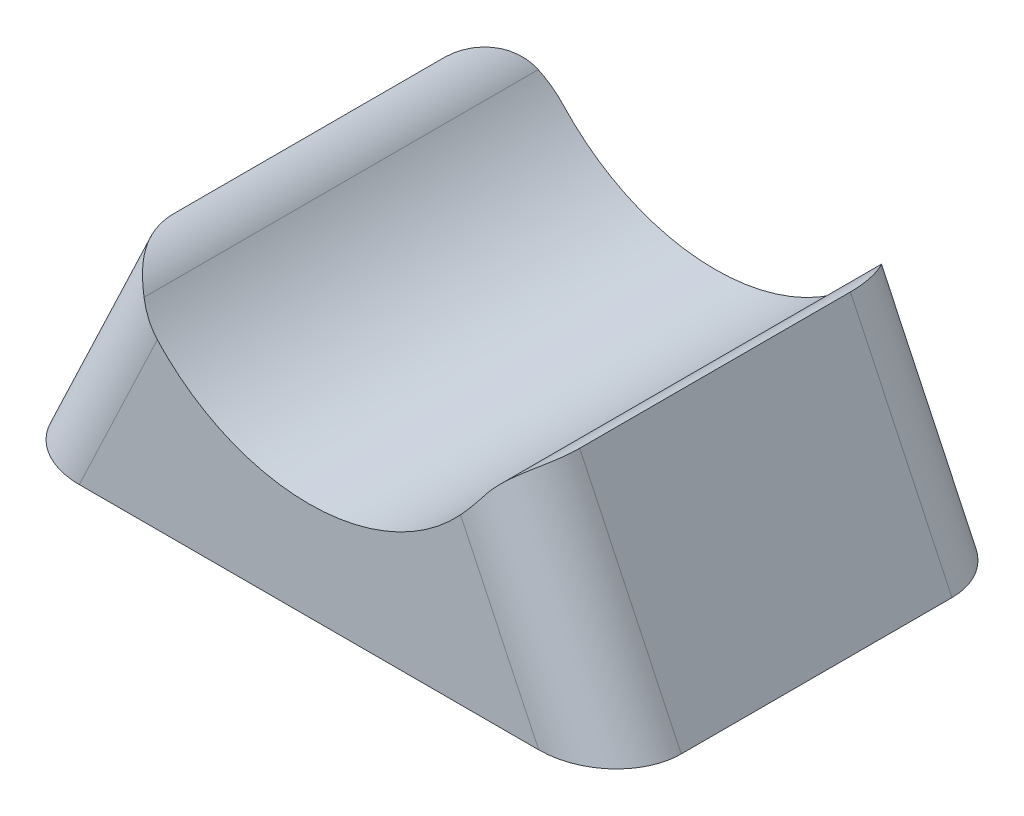
ISO-10303-21;
HEADER;
FILE_DESCRIPTION(('STEP AP214'),'2;1');
FILE_NAME('part.step','',(''),(''),'','','');
FILE_SCHEMA(('AUTOMOTIVE_DESIGN { 1 0 10303 214 1 1 1 1 }'));
ENDSEC;
DATA;
#1=APPLICATION_CONTEXT('core data for automotive mechanical design processes');
#2=APPLICATION_PROTOCOL_DEFINITION('international standard','automotive_design',2000,#1);
#3=PRODUCT_CONTEXT('',#1,'mechanical');
#4=PRODUCT('Part','Part','',(#3));
#5=PRODUCT_RELATED_PRODUCT_CATEGORY('part','',(#4));
#6=PRODUCT_DEFINITION_FORMATION('','',#4);
#7=PRODUCT_DEFINITION_CONTEXT('part definition',#1,'design');
#8=PRODUCT_DEFINITION('design','',#6,#7);
#9=PRODUCT_DEFINITION_SHAPE('','',#8);
#10=(LENGTH_UNIT() NAMED_UNIT(*) SI_UNIT(.MILLI.,.METRE.));
#11=(NAMED_UNIT(*) PLANE_ANGLE_UNIT() SI_UNIT($,.RADIAN.));
#12=(NAMED_UNIT(*) SI_UNIT($,.STERADIAN.) SOLID_ANGLE_UNIT());
#13=UNCERTAINTY_MEASURE_WITH_UNIT(LENGTH_MEASURE(1.E-05),#10,'distance_accuracy_value','');
#14=(GEOMETRIC_REPRESENTATION_CONTEXT(3) GLOBAL_UNCERTAINTY_ASSIGNED_CONTEXT((#13)) GLOBAL_UNIT_ASSIGNED_CONTEXT((#10,
#11,#12)) REPRESENTATION_CONTEXT('',''));
#15=CARTESIAN_POINT('',(0.,0.,0.));
#16=DIRECTION('',(0.,0.,1.));
#17=DIRECTION('',(1.,0.,0.));
#18=AXIS2_PLACEMENT_3D('',#15,#16,#17);
#19=CARTESIAN_POINT('',(9.00000000000001,0.,-6.));
#20=DIRECTION('',(0.903507902905251,0.428571428571429,0.));
#21=DIRECTION('',(-0.428571428571429,0.903507902905251,0.));
#22=AXIS2_PLACEMENT_3D('',#19,#20,#21);
#23=PLANE('',#22);
#24=DIRECTION('',(0.,0.,1.));
#25=VECTOR('',#24,1.);
#26=CARTESIAN_POINT('',(9.00000000000001,0.,-6.));
#27=LINE('',#26,#25);
#28=CARTESIAN_POINT('',(9.00000000000001,0.,-4.));
#29=VERTEX_POINT('',#28);
#30=CARTESIAN_POINT('',(9.00000000000001,0.,4.));
#31=VERTEX_POINT('',#30);
#32=EDGE_CURVE('E142',#29,#31,#27,.T.);
#33=ORIENTED_EDGE('',*,*,#32,.F.);
#34=DIRECTION('',(-0.428571428571429,0.903507902905251,0.));
#35=VECTOR('',#34,1.);
#36=CARTESIAN_POINT('',(6.,6.32455532033676,-4.));
#37=LINE('',#36,#35);
#38=CARTESIAN_POINT('',(6.,6.32455532033676,-4.));
#39=VERTEX_POINT('',#38);
#40=EDGE_CURVE('E168',#29,#39,#37,.T.);
#41=ORIENTED_EDGE('',*,*,#40,.T.);
#42=DIRECTION('',(0.,0.,1.));
#43=VECTOR('',#42,1.);
#44=CARTESIAN_POINT('',(6.,6.32455532033676,-6.));
#45=LINE('',#44,#43);
#46=CARTESIAN_POINT('',(6.,6.32455532033676,4.));
#47=VERTEX_POINT('',#46);
#48=EDGE_CURVE('E254',#39,#47,#45,.T.);
#49=ORIENTED_EDGE('',*,*,#48,.T.);
#50=DIRECTION('',(-0.428571428571429,0.903507902905251,0.));
#51=VECTOR('',#50,1.);
#52=CARTESIAN_POINT('',(9.00000000000001,0.,4.));
#53=LINE('',#52,#51);
#54=EDGE_CURVE('E148',#47,#31,#53,.F.);
#55=ORIENTED_EDGE('',*,*,#54,.T.);
#56=EDGE_LOOP('',(#33,#41,#49,#55));
#57=FACE_BOUND('',#56,.T.);
#58=ADVANCED_FACE('F38',(#57),#23,.T.);
#59=CARTESIAN_POINT('',(0.,0.,0.));
#60=DIRECTION('',(0.,1.,0.));
#61=DIRECTION('',(0.,0.,1.));
#62=AXIS2_PLACEMENT_3D('',#59,#60,#61);
#63=PLANE('',#62);
#64=DIRECTION('',(0.,0.,1.));
#65=VECTOR('',#64,1.);
#66=CARTESIAN_POINT('',(-9.,0.,-6.));
#67=LINE('',#66,#65);
#68=CARTESIAN_POINT('',(-9.,0.,-4.));
#69=VERTEX_POINT('',#68);
#70=CARTESIAN_POINT('',(-9.,0.,4.));
#71=VERTEX_POINT('',#70);
#72=EDGE_CURVE('E261',#69,#71,#67,.T.);
#73=ORIENTED_EDGE('',*,*,#72,.F.);
#74=CARTESIAN_POINT('',(-6.78640563788213,0.,-4.));
#75=DIRECTION('',(0.,1.,0.));
#76=DIRECTION('',(1.,0.,0.));
#77=AXIS2_PLACEMENT_3D('',#74,#75,#76);
#78=ELLIPSE('',#77,2.21359436211787,2.);
#79=CARTESIAN_POINT('',(-6.78640563788213,0.,-6.));
#80=VERTEX_POINT('',#79);
#81=EDGE_CURVE('E277',#69,#80,#78,.F.);
#82=ORIENTED_EDGE('',*,*,#81,.T.);
#83=DIRECTION('',(-1.,0.,0.));
#84=VECTOR('',#83,1.);
#85=CARTESIAN_POINT('',(-6.,0.,-6.));
#86=LINE('',#85,#84);
#87=CARTESIAN_POINT('',(6.78640563788214,0.,-6.));
#88=VERTEX_POINT('',#87);
#89=EDGE_CURVE('E135',#88,#80,#86,.T.);
#90=ORIENTED_EDGE('',*,*,#89,.F.);
#91=CARTESIAN_POINT('',(6.78640563788214,0.,-4.));
#92=DIRECTION('',(0.,1.,0.));
#93=DIRECTION('',(1.,0.,0.));
#94=AXIS2_PLACEMENT_3D('',#91,#92,#93);
#95=ELLIPSE('',#94,2.21359436211787,2.);
#96=EDGE_CURVE('E200',#88,#29,#95,.F.);
#97=ORIENTED_EDGE('',*,*,#96,.T.);
#98=ORIENTED_EDGE('',*,*,#32,.T.);
#99=CARTESIAN_POINT('',(6.78640563788214,0.,4.));
#100=DIRECTION('',(0.,1.,0.));
#101=DIRECTION('',(1.,0.,0.));
#102=AXIS2_PLACEMENT_3D('',#99,#100,#101);
#103=ELLIPSE('',#102,2.21359436211787,2.);
#104=CARTESIAN_POINT('',(6.78640563788214,0.,6.));
#105=VERTEX_POINT('',#104);
#106=EDGE_CURVE('E138',#31,#105,#103,.F.);
#107=ORIENTED_EDGE('',*,*,#106,.T.);
#108=DIRECTION('',(1.,0.,0.));
#109=VECTOR('',#108,1.);
#110=CARTESIAN_POINT('',(-6.,0.,6.));
#111=LINE('',#110,#109);
#112=CARTESIAN_POINT('',(-6.78640563788213,0.,6.));
#113=VERTEX_POINT('',#112);
#114=EDGE_CURVE('E123',#113,#105,#111,.T.);
#115=ORIENTED_EDGE('',*,*,#114,.F.);
#116=CARTESIAN_POINT('',(-6.78640563788213,0.,4.));
#117=DIRECTION('',(0.,1.,0.));
#118=DIRECTION('',(1.,0.,0.));
#119=AXIS2_PLACEMENT_3D('',#116,#117,#118);
#120=ELLIPSE('',#119,2.21359436211787,2.);
#121=EDGE_CURVE('E285',#113,#71,#120,.F.);
#122=ORIENTED_EDGE('',*,*,#121,.T.);
#123=EDGE_LOOP('',(#73,#82,#90,#97,#98,#107,#115,#122));
#124=FACE_BOUND('',#123,.T.);
#125=ADVANCED_FACE('F140',(#124),#63,.F.);
#126=CARTESIAN_POINT('',(-9.,0.,-6.));
#127=DIRECTION('',(-0.903507902905251,0.428571428571429,0.));
#128=DIRECTION('',(-0.428571428571429,-0.903507902905251,0.));
#129=AXIS2_PLACEMENT_3D('',#126,#127,#128);
#130=PLANE('',#129);
#131=DIRECTION('',(0.,0.,1.));
#132=VECTOR('',#131,1.);
#133=CARTESIAN_POINT('',(-6.,6.32455532033676,-6.));
#134=LINE('',#133,#132);
#135=CARTESIAN_POINT('',(-6.,6.32455532033676,-4.));
#136=VERTEX_POINT('',#135);
#137=CARTESIAN_POINT('',(-6.,6.32455532033676,4.));
#138=VERTEX_POINT('',#137);
#139=EDGE_CURVE('E257',#136,#138,#134,.T.);
#140=ORIENTED_EDGE('',*,*,#139,.F.);
#141=DIRECTION('',(-0.428571428571429,-0.903507902905251,0.));
#142=VECTOR('',#141,1.);
#143=CARTESIAN_POINT('',(-9.,0.,-4.));
#144=LINE('',#143,#142);
#145=EDGE_CURVE('E297',#136,#69,#144,.T.);
#146=ORIENTED_EDGE('',*,*,#145,.T.);
#147=ORIENTED_EDGE('',*,*,#72,.T.);
#148=DIRECTION('',(-0.428571428571429,-0.903507902905251,0.));
#149=VECTOR('',#148,1.);
#150=CARTESIAN_POINT('',(-6.,6.32455532033676,4.));
#151=LINE('',#150,#149);
#152=EDGE_CURVE('E67',#71,#138,#151,.F.);
#153=ORIENTED_EDGE('',*,*,#152,.T.);
#154=EDGE_LOOP('',(#140,#146,#147,#153));
#155=FACE_BOUND('',#154,.T.);
#156=ADVANCED_FACE('F307',(#155),#130,.T.);
#157=CARTESIAN_POINT('',(-6.,17.,6.));
#158=DIRECTION('',(0.,0.,-1.));
#159=DIRECTION('',(-1.,0.,0.));
#160=AXIS2_PLACEMENT_3D('',#157,#158,#159);
#161=PLANE('',#160);
#162=CARTESIAN_POINT('',(0.,9.,6.));
#163=DIRECTION('',(0.,0.,-1.));
#164=DIRECTION('',(-1.,0.,0.));
#165=AXIS2_PLACEMENT_3D('',#162,#163,#164);
#166=CIRCLE('',#165,6.1);
#167=CARTESIAN_POINT('',(4.48073029755396,4.86079041354729,6.));
#168=VERTEX_POINT('',#167);
#169=CARTESIAN_POINT('',(-4.48073029755395,4.86079041354729,6.));
#170=VERTEX_POINT('',#169);
#171=EDGE_CURVE('E134',#168,#170,#166,.T.);
#172=ORIENTED_EDGE('',*,*,#171,.T.);
#173=DIRECTION('',(-0.428571428571429,-0.903507902905251,0.));
#174=VECTOR('',#173,1.);
#175=CARTESIAN_POINT('',(-7.1929841941895,-0.857142857142862,6.));
#176=LINE('',#175,#174);
#177=EDGE_CURVE('E131',#170,#113,#176,.T.);
#178=ORIENTED_EDGE('',*,*,#177,.T.);
#179=ORIENTED_EDGE('',*,*,#114,.T.);
#180=DIRECTION('',(-0.428571428571429,0.903507902905251,0.));
#181=VECTOR('',#180,1.);
#182=CARTESIAN_POINT('',(4.1929841941895,5.4674124631939,6.));
#183=LINE('',#182,#181);
#184=EDGE_CURVE('E128',#105,#168,#183,.T.);
#185=ORIENTED_EDGE('',*,*,#184,.T.);
#186=EDGE_LOOP('',(#172,#178,#179,#185));
#187=FACE_BOUND('',#186,.T.);
#188=ADVANCED_FACE('F126',(#187),#161,.F.);
#189=CARTESIAN_POINT('',(-6.,17.,-6.));
#190=DIRECTION('',(0.,0.,1.));
#191=DIRECTION('',(1.,0.,0.));
#192=AXIS2_PLACEMENT_3D('',#189,#190,#191);
#193=PLANE('',#192);
#194=DIRECTION('',(-0.428571428571429,-0.903507902905251,0.));
#195=VECTOR('',#194,1.);
#196=CARTESIAN_POINT('',(-4.19298419418949,5.4674124631939,-6.));
#197=LINE('',#196,#195);
#198=CARTESIAN_POINT('',(-4.48073029755395,4.86079041354729,-6.));
#199=VERTEX_POINT('',#198);
#200=EDGE_CURVE('E274',#80,#199,#197,.F.);
#201=ORIENTED_EDGE('',*,*,#200,.T.);
#202=CARTESIAN_POINT('',(0.,9.,-6.));
#203=DIRECTION('',(0.,0.,1.));
#204=DIRECTION('',(1.,0.,0.));
#205=AXIS2_PLACEMENT_3D('',#202,#203,#204);
#206=CIRCLE('',#205,6.1);
#207=CARTESIAN_POINT('',(4.48073029755396,4.86079041354729,-6.));
#208=VERTEX_POINT('',#207);
#209=EDGE_CURVE('E263',#199,#208,#206,.T.);
#210=ORIENTED_EDGE('',*,*,#209,.T.);
#211=DIRECTION('',(-0.428571428571429,0.903507902905251,0.));
#212=VECTOR('',#211,1.);
#213=CARTESIAN_POINT('',(7.1929841941895,-0.857142857142858,-6.));
#214=LINE('',#213,#212);
#215=EDGE_CURVE('E252',#208,#88,#214,.F.);
#216=ORIENTED_EDGE('',*,*,#215,.T.);
#217=ORIENTED_EDGE('',*,*,#89,.T.);
#218=EDGE_LOOP('',(#201,#210,#216,#217));
#219=FACE_BOUND('',#218,.T.);
#220=ADVANCED_FACE('F177',(#219),#193,.F.);
#221=CARTESIAN_POINT('',(0.,9.,-10.));
#222=DIRECTION('',(0.,0.,1.));
#223=DIRECTION('',(1.,0.,0.));
#224=AXIS2_PLACEMENT_3D('',#221,#222,#223);
#225=CYLINDRICAL_SURFACE('',#224,6.1);
#226=CARTESIAN_POINT('',(4.48073029755396,4.86079041354729,6.));
#227=CARTESIAN_POINT('',(4.52608697202444,4.90987452180468,6.0000035549637));
#228=CARTESIAN_POINT('',(4.57060589512211,4.95969966760544,5.99711617886125));
#229=CARTESIAN_POINT('',(4.65766304651646,5.06038476953079,5.98582792786272));
#230=CARTESIAN_POINT('',(4.70020268440848,5.11124395096632,5.97743104310914));
#231=CARTESIAN_POINT('',(4.78300793678731,5.21355466399986,5.95540588617771));
#232=CARTESIAN_POINT('',(4.8232764717875,5.26500532745654,5.94178451686554));
#233=CARTESIAN_POINT('',(4.90142200166976,5.36816091562967,5.90958079203411));
#234=CARTESIAN_POINT('',(4.93929863509925,5.41986587750804,5.89099768892937));
#235=CARTESIAN_POINT('',(5.04891523616141,5.57445835342891,5.82831606321844));
#236=CARTESIAN_POINT('',(5.11695006323862,5.67720741686608,5.77719995793819));
#237=CARTESIAN_POINT('',(5.24245956031297,5.87898685537172,5.65795416499121));
#238=CARTESIAN_POINT('',(5.29994830494353,5.97802204430922,5.58984744364042));
#239=CARTESIAN_POINT('',(5.36322368843608,6.09373574679189,5.49766848356468));
#240=CARTESIAN_POINT('',(5.37407748969819,6.11385997470447,5.48114977999795));
#241=CARTESIAN_POINT('',(5.39529803416801,6.15372772036676,5.4474153407801));
#242=CARTESIAN_POINT('',(5.40566537190832,6.17347168447706,5.43020050651546));
#243=CARTESIAN_POINT('',(5.41579943134861,6.19302359835283,5.41262591304035));
#244=B_SPLINE_CURVE_WITH_KNOTS('',3,(#226,#227,#228,#229,#230,#231,#232,#233,#234,#235,#236,
#237,#238,#239,#240,#241,#242,#243),.UNSPECIFIED.,.F.,.F.,(4,2,2,2,2,2,2,2,4),(0.,
0.200387564624591,0.400630162838555,0.600609096280458,0.800618177609773,1.19915507630846,
1.59715616183225,1.68176990838431,1.76627739664528),.UNSPECIFIED.);
#245=CARTESIAN_POINT('',(5.04772121299987,5.57501670721865,5.82489940778043));
#246=VERTEX_POINT('',#245);
#247=EDGE_CURVE('E147',#168,#246,#244,.T.);
#248=ORIENTED_EDGE('',*,*,#247,.T.);
#249=DIRECTION('',(0.,0.,1.));
#250=VECTOR('',#249,1.);
#251=CARTESIAN_POINT('',(5.04772121299985,5.57501670721865,-10.));
#252=LINE('',#251,#250);
#253=CARTESIAN_POINT('',(5.04772121299989,5.57501670721864,-5.82489940777913));
#254=VERTEX_POINT('',#253);
#255=EDGE_CURVE('E219',#246,#254,#252,.F.);
#256=ORIENTED_EDGE('',*,*,#255,.T.);
#257=CARTESIAN_POINT('',(5.41579943134862,6.19302359835284,-5.4126259130403));
#258=CARTESIAN_POINT('',(5.38448198819415,6.13256791069277,-5.46692317409102));
#259=CARTESIAN_POINT('',(5.35090242541825,6.07028620485593,-5.51786056711631));
#260=CARTESIAN_POINT('',(5.27921316605117,5.94300831919594,-5.61277294149944));
#261=CARTESIAN_POINT('',(5.24110074438522,5.87801052189091,-5.65674369721884));
#262=CARTESIAN_POINT('',(5.16181436132826,5.74865721270911,-5.73597817975022));
#263=CARTESIAN_POINT('',(5.12079765511709,5.68436118499926,-5.77149611351895));
#264=CARTESIAN_POINT('',(5.0346928611622,5.5550166271021,-5.83537536727111));
#265=CARTESIAN_POINT('',(4.98960664744407,5.48996845519189,-5.86373995879725));
#266=CARTESIAN_POINT('',(4.8742571389432,5.33051493534182,-5.92394763448433));
#267=CARTESIAN_POINT('',(4.80178597554568,5.23605568003209,-5.95162387570386));
#268=CARTESIAN_POINT('',(4.68667045987297,5.09500854212513,-5.98019228218955));
#269=CARTESIAN_POINT('',(4.64666731252061,5.04748731954322,-5.98756442781132));
#270=CARTESIAN_POINT('',(4.56493552182971,4.95336439836789,-5.99746961694053));
#271=CARTESIAN_POINT('',(4.52320539640575,4.90676354250041,-5.99999841207819));
#272=CARTESIAN_POINT('',(4.48073029755396,4.86079041354729,-6.));
#273=B_SPLINE_CURVE_WITH_KNOTS('',3,(#257,#258,#259,#260,#261,#262,#263,#264,#265,#266,#267,
#268,#269,#270,#271,#272),.UNSPECIFIED.,.F.,.F.,(4,2,2,2,2,2,2,4),(0.,0.261124082370834,
0.522405949081154,0.774387891264846,1.02625438101215,1.39132745271432,1.57879866162821,
1.766434236701),.UNSPECIFIED.);
#274=EDGE_CURVE('E192',#254,#208,#273,.T.);
#275=ORIENTED_EDGE('',*,*,#274,.T.);
#276=ORIENTED_EDGE('',*,*,#209,.F.);
#277=CARTESIAN_POINT('',(-4.48073029755395,4.86079041354729,-6.));
#278=CARTESIAN_POINT('',(-4.52608697202444,4.90987452180468,-6.00000355496369));
#279=CARTESIAN_POINT('',(-4.57060589512211,4.95969966760544,-5.99711617886125));
#280=CARTESIAN_POINT('',(-4.65766304651645,5.06038476953079,-5.98582792786272));
#281=CARTESIAN_POINT('',(-4.70020268440848,5.11124395096632,-5.97743104310913));
#282=CARTESIAN_POINT('',(-4.78300793678731,5.21355466399986,-5.95540588617771));
#283=CARTESIAN_POINT('',(-4.8232764717875,5.26500532745654,-5.94178451686554));
#284=CARTESIAN_POINT('',(-4.90142200166975,5.36816091562967,-5.9095807920341));
#285=CARTESIAN_POINT('',(-4.93929863509925,5.41986587750804,-5.89099768892937));
#286=CARTESIAN_POINT('',(-5.04891523616141,5.57445835342891,-5.82831606321843));
#287=CARTESIAN_POINT('',(-5.11695006323861,5.67720741686608,-5.77719995793818));
#288=CARTESIAN_POINT('',(-5.24245956031296,5.87898685537172,-5.65795416499121));
#289=CARTESIAN_POINT('',(-5.29994830494352,5.97802204430922,-5.58984744364042));
#290=CARTESIAN_POINT('',(-5.36322368843608,6.0937357467919,-5.49766848356467));
#291=CARTESIAN_POINT('',(-5.37407748969819,6.11385997470448,-5.48114977999794));
#292=CARTESIAN_POINT('',(-5.39529803416802,6.15372772036677,-5.44741534078008));
#293=CARTESIAN_POINT('',(-5.40566537190833,6.17347168447708,-5.43020050651543));
#294=CARTESIAN_POINT('',(-5.41579943134862,6.19302359835286,-5.41262591304032));
#295=B_SPLINE_CURVE_WITH_KNOTS('',3,(#277,#278,#279,#280,#281,#282,#283,#284,#285,#286,#287,
#288,#289,#290,#291,#292,#293,#294),.UNSPECIFIED.,.F.,.F.,(4,2,2,2,2,2,2,2,4),(0.,
0.200387564624591,0.400630162838554,0.600609096280457,0.800618177609772,1.19915507630846,
1.59715616183225,1.68176990838433,1.76627739664532),.UNSPECIFIED.);
#296=CARTESIAN_POINT('',(-5.04772121299987,5.57501670721865,-5.82489940778043));
#297=VERTEX_POINT('',#296);
#298=EDGE_CURVE('E279',#199,#297,#295,.T.);
#299=ORIENTED_EDGE('',*,*,#298,.T.);
#300=DIRECTION('',(0.,0.,1.));
#301=VECTOR('',#300,1.);
#302=CARTESIAN_POINT('',(-5.04772121299983,5.57501670721864,-10.));
#303=LINE('',#302,#301);
#304=CARTESIAN_POINT('',(-5.04772121299988,5.57501670721863,5.82489940777914));
#305=VERTEX_POINT('',#304);
#306=EDGE_CURVE('E238',#297,#305,#303,.T.);
#307=ORIENTED_EDGE('',*,*,#306,.T.);
#308=CARTESIAN_POINT('',(-5.4157994313486,6.19302359835282,5.41262591304032));
#309=CARTESIAN_POINT('',(-5.38448198819413,6.13256791069275,5.46692317409105));
#310=CARTESIAN_POINT('',(-5.35090242541823,6.07028620485591,5.51786056711633));
#311=CARTESIAN_POINT('',(-5.27921316605115,5.94300831919591,5.61277294149946));
#312=CARTESIAN_POINT('',(-5.24110074438519,5.87801052189089,5.65674369721886));
#313=CARTESIAN_POINT('',(-5.16181436132824,5.74865721270909,5.73597817975024));
#314=CARTESIAN_POINT('',(-5.12079765511707,5.68436118499923,5.77149611351896));
#315=CARTESIAN_POINT('',(-5.03469286116218,5.55501662710208,5.83537536727113));
#316=CARTESIAN_POINT('',(-4.98960664744405,5.48996845519186,5.86373995879727));
#317=CARTESIAN_POINT('',(-4.87425713894318,5.3305149353418,5.92394763448435));
#318=CARTESIAN_POINT('',(-4.80178597554567,5.23605568003208,5.95162387570387));
#319=CARTESIAN_POINT('',(-4.68667045987296,5.09500854212512,5.98019228218956));
#320=CARTESIAN_POINT('',(-4.6466673125206,5.04748731954321,5.98756442781132));
#321=CARTESIAN_POINT('',(-4.5649355218297,4.95336439836789,5.99746961694053));
#322=CARTESIAN_POINT('',(-4.52320539640574,4.90676354250041,5.9999984120782));
#323=CARTESIAN_POINT('',(-4.48073029755395,4.86079041354729,6.));
#324=B_SPLINE_CURVE_WITH_KNOTS('',3,(#308,#309,#310,#311,#312,#313,#314,#315,#316,#317,#318,
#319,#320,#321,#322,#323),.UNSPECIFIED.,.F.,.F.,(4,2,2,2,2,2,2,4),(0.,0.261124082370834,
0.522405949081154,0.774387891264846,1.02625438101215,1.39132745271431,1.57879866162819,
1.76643423670097),.UNSPECIFIED.);
#325=EDGE_CURVE('E183',#305,#170,#324,.T.);
#326=ORIENTED_EDGE('',*,*,#325,.T.);
#327=ORIENTED_EDGE('',*,*,#171,.F.);
#328=EDGE_LOOP('',(#248,#256,#275,#276,#299,#307,#326,#327));
#329=FACE_BOUND('',#328,.T.);
#330=ADVANCED_FACE('F173',(#329),#225,.F.);
#331=CARTESIAN_POINT('',(-2.14481828207937,18.8286732533705,4.));
#332=DIRECTION('',(0.428571428571429,-0.903507902905251,0.));
#333=DIRECTION('',(0.903507902905251,0.428571428571429,0.));
#334=AXIS2_PLACEMENT_3D('',#331,#332,#333);
#335=CYLINDRICAL_SURFACE('',#334,2.);
#336=ORIENTED_EDGE('',*,*,#54,.F.);
#337=CARTESIAN_POINT('',(6.,6.32455532033675,4.));
#338=CARTESIAN_POINT('',(6.00001260468599,6.32454145810836,4.05603144664232));
#339=CARTESIAN_POINT('',(5.99778795499792,6.323724732727,4.1120595367479));
#340=CARTESIAN_POINT('',(5.98895842450395,6.3203852564015,4.22371387512068));
#341=CARTESIAN_POINT('',(5.98235390845106,6.3178626475221,4.27934015646038));
#342=CARTESIAN_POINT('',(5.96484734211423,6.31100661218751,4.38987814735602));
#343=CARTESIAN_POINT('',(5.95393962823184,6.30667079885331,4.44478881627879));
#344=CARTESIAN_POINT('',(5.92802152830542,6.29599357417369,4.55341983430318));
#345=CARTESIAN_POINT('',(5.91301112822232,6.28965215596524,4.60714017933094));
#346=CARTESIAN_POINT('',(5.86215464288764,6.26724685868284,4.76599994429102));
#347=CARTESIAN_POINT('',(5.82047618254872,6.24779965273234,4.8688813598539));
#348=CARTESIAN_POINT('',(5.72428899601454,6.19723992256828,5.06538064995601));
#349=CARTESIAN_POINT('',(5.66978795371531,6.16613437798656,5.15900402481293));
#350=CARTESIAN_POINT('',(5.58226219383752,6.10910464809195,5.28893682744999));
#351=CARTESIAN_POINT('',(5.5525651360653,6.08871001581853,5.33000725694107));
#352=CARTESIAN_POINT('',(5.49167685210451,6.04418195212584,5.40886892652422));
#353=CARTESIAN_POINT('',(5.46048649238544,6.02005067111473,5.44666203329284));
#354=CARTESIAN_POINT('',(5.39732624758748,5.96786883096234,5.51857252361453));
#355=CARTESIAN_POINT('',(5.36535791381131,5.93982561596657,5.55269658751556));
#356=CARTESIAN_POINT('',(5.3013464949652,5.87969315733936,5.61704952941442));
#357=CARTESIAN_POINT('',(5.26930346223683,5.84760620506091,5.64728059388919));
#358=CARTESIAN_POINT('',(5.20461750890206,5.77798752538141,5.70482121876528));
#359=CARTESIAN_POINT('',(5.17200420598318,5.74028601867499,5.7319592518288));
#360=CARTESIAN_POINT('',(5.10840516892743,5.6607120294427,5.78178975056869));
#361=CARTESIAN_POINT('',(5.07742126719858,5.61883499815897,5.80447728633715));
#362=CARTESIAN_POINT('',(5.04772121299947,5.57501670721809,5.82489940777935));
#363=B_SPLINE_CURVE_WITH_KNOTS('',3,(#337,#338,#339,#340,#341,#342,#343,#344,#345,#346,#347,
#348,#349,#350,#351,#352,#353,#354,#355,#356,#357,#358,#359,#360,#361,#362),.UNSPECIFIED.,.F.,
.F.,(4,2,2,2,2,2,2,2,2,2,2,2,4),(0.,0.168038375215024,0.336062758037627,0.504309025730842,
0.67255586915718,1.00891952181869,1.34508212060993,1.50877349863879,1.67237102146064,
1.83566544436215,1.99886775029121,2.16878934553394,2.33889811653433),.UNSPECIFIED.);
#364=EDGE_CURVE('E232',#47,#246,#363,.T.);
#365=ORIENTED_EDGE('',*,*,#364,.T.);
#366=ORIENTED_EDGE('',*,*,#247,.F.);
#367=ORIENTED_EDGE('',*,*,#184,.F.);
#368=ORIENTED_EDGE('',*,*,#106,.F.);
#369=EDGE_LOOP('',(#336,#365,#366,#367,#368));
#370=FACE_BOUND('',#369,.T.);
#371=ADVANCED_FACE('F150',(#370),#335,.T.);
#372=CARTESIAN_POINT('',(7.1929841941895,-0.857142857142858,-4.));
#373=DIRECTION('',(0.428571428571429,-0.903507902905251,0.));
#374=DIRECTION('',(0.903507902905251,0.428571428571429,0.));
#375=AXIS2_PLACEMENT_3D('',#372,#373,#374);
#376=CYLINDRICAL_SURFACE('',#375,2.);
#377=ORIENTED_EDGE('',*,*,#274,.F.);
#378=CARTESIAN_POINT('',(5.04772121299985,5.57501670721865,-5.82489940777909));
#379=CARTESIAN_POINT('',(5.07193503139065,5.61072384444683,-5.80823954178869));
#380=CARTESIAN_POINT('',(5.0969972765947,5.64515413490471,-5.79008969632129));
#381=CARTESIAN_POINT('',(5.14832523513693,5.71128577474174,-5.75082032993836));
#382=CARTESIAN_POINT('',(5.17459034254372,5.74298847544738,-5.72970229336788));
#383=CARTESIAN_POINT('',(5.22767579288503,5.80332108869711,-5.68464295494522));
#384=CARTESIAN_POINT('',(5.25449118558301,5.83197031465151,-5.66072169177082));
#385=CARTESIAN_POINT('',(5.30835613554663,5.8863793006305,-5.610046488648));
#386=CARTESIAN_POINT('',(5.33540570265167,5.91213893860122,-5.58329242913725));
#387=CARTESIAN_POINT('',(5.41614040241437,5.98503437698096,-5.49903021043249));
#388=CARTESIAN_POINT('',(5.4695138057738,6.02789900742464,-5.43743733749118));
#389=CARTESIAN_POINT('',(5.57201622781052,6.10300797050006,-5.30494814988922));
#390=CARTESIAN_POINT('',(5.6211398810745,6.13523901828124,-5.23404035120795));
#391=CARTESIAN_POINT('',(5.71486247972194,6.19198764825994,-5.08081997842418));
#392=CARTESIAN_POINT('',(5.75909818075562,6.21602257852448,-4.99810815197793));
#393=CARTESIAN_POINT('',(5.83770390389321,6.25587692844559,-4.82620258989496));
#394=CARTESIAN_POINT('',(5.87206770697424,6.27169117435345,-4.73700481242692));
#395=CARTESIAN_POINT('',(5.91685176075404,6.29129125052965,-4.59375475891264));
#396=CARTESIAN_POINT('',(5.93119918952602,6.2973210901436,-4.54119028218694));
#397=CARTESIAN_POINT('',(5.95596799648313,6.30748342144254,-4.43494725216411));
#398=CARTESIAN_POINT('',(5.96638895583142,6.31161571072594,-4.38126858065972));
#399=CARTESIAN_POINT('',(5.98312611427489,6.31815857709226,-4.27317703489199));
#400=CARTESIAN_POINT('',(5.98944254375232,6.32056925080812,-4.21876420201126));
#401=CARTESIAN_POINT('',(5.99788525585829,6.32376123647118,-4.10956850240805));
#402=CARTESIAN_POINT('',(6.00001164022988,6.32454258798177,-4.05478564470295));
#403=CARTESIAN_POINT('',(6.,6.32455532033676,-4.));
#404=B_SPLINE_CURVE_WITH_KNOTS('',3,(#378,#379,#380,#381,#382,#383,#384,#385,#386,#387,#388,
#389,#390,#391,#392,#393,#394,#395,#396,#397,#398,#399,#400,#401,#402,#403),.UNSPECIFIED.,.F.,
.F.,(4,2,2,2,2,2,2,2,2,2,2,2,4),(0.,0.138687796774119,0.277306483139117,0.414988626179022,
0.552676582614658,0.827537861398588,1.10274124353088,1.3921156956245,1.68167204785383,
1.84597303991522,2.01029155301957,2.1746008423292,2.33890614181641),.UNSPECIFIED.);
#405=EDGE_CURVE('E211',#254,#39,#404,.T.);
#406=ORIENTED_EDGE('',*,*,#405,.T.);
#407=ORIENTED_EDGE('',*,*,#40,.F.);
#408=ORIENTED_EDGE('',*,*,#96,.F.);
#409=ORIENTED_EDGE('',*,*,#215,.F.);
#410=EDGE_LOOP('',(#377,#406,#407,#408,#409));
#411=FACE_BOUND('',#410,.T.);
#412=ADVANCED_FACE('F202',(#411),#376,.T.);
#413=CARTESIAN_POINT('',(-7.19298419418949,-0.857142857142858,-4.));
#414=DIRECTION('',(0.428571428571429,0.903507902905251,0.));
#415=DIRECTION('',(-0.903507902905251,0.428571428571429,0.));
#416=AXIS2_PLACEMENT_3D('',#413,#414,#415);
#417=CYLINDRICAL_SURFACE('',#416,2.);
#418=ORIENTED_EDGE('',*,*,#145,.F.);
#419=CARTESIAN_POINT('',(-5.99999999999999,6.32455532033678,-4.));
#420=CARTESIAN_POINT('',(-6.00001260468599,6.32454145810837,-4.05603144664231));
#421=CARTESIAN_POINT('',(-5.99778795499792,6.323724732727,-4.1120595367479));
#422=CARTESIAN_POINT('',(-5.98895842450394,6.32038525640149,-4.22371387512068));
#423=CARTESIAN_POINT('',(-5.98235390845105,6.3178626475221,-4.27934015646037));
#424=CARTESIAN_POINT('',(-5.96484734211423,6.31100661218751,-4.38987814735602));
#425=CARTESIAN_POINT('',(-5.95393962823183,6.30667079885331,-4.44478881627878));
#426=CARTESIAN_POINT('',(-5.92802152830542,6.29599357417369,-4.55341983430318));
#427=CARTESIAN_POINT('',(-5.91301112822232,6.28965215596523,-4.60714017933093));
#428=CARTESIAN_POINT('',(-5.86215464288763,6.26724685868284,-4.76599994429102));
#429=CARTESIAN_POINT('',(-5.82047618254871,6.24779965273234,-4.8688813598539));
#430=CARTESIAN_POINT('',(-5.72428899601453,6.19723992256828,-5.06538064995601));
#431=CARTESIAN_POINT('',(-5.6697879537153,6.16613437798656,-5.15900402481293));
#432=CARTESIAN_POINT('',(-5.58226219383751,6.10910464809194,-5.28893682744999));
#433=CARTESIAN_POINT('',(-5.55256513606529,6.08871001581852,-5.33000725694107));
#434=CARTESIAN_POINT('',(-5.49167685210449,6.04418195212584,-5.40886892652422));
#435=CARTESIAN_POINT('',(-5.46048649238543,6.02005067111473,-5.44666203329284));
#436=CARTESIAN_POINT('',(-5.39732624758747,5.96786883096234,-5.51857252361453));
#437=CARTESIAN_POINT('',(-5.3653579138113,5.93982561596657,-5.55269658751556));
#438=CARTESIAN_POINT('',(-5.30134649496519,5.87969315733936,-5.61704952941442));
#439=CARTESIAN_POINT('',(-5.26930346223682,5.84760620506091,-5.64728059388919));
#440=CARTESIAN_POINT('',(-5.20461750890205,5.7779875253814,-5.70482121876528));
#441=CARTESIAN_POINT('',(-5.17200420598317,5.74028601867499,-5.7319592518288));
#442=CARTESIAN_POINT('',(-5.10840516892742,5.66071202944269,-5.78178975056869));
#443=CARTESIAN_POINT('',(-5.07742126719856,5.61883499815896,-5.80447728633715));
#444=CARTESIAN_POINT('',(-5.04772121299946,5.57501670721809,-5.82489940777935));
#445=B_SPLINE_CURVE_WITH_KNOTS('',3,(#419,#420,#421,#422,#423,#424,#425,#426,#427,#428,#429,
#430,#431,#432,#433,#434,#435,#436,#437,#438,#439,#440,#441,#442,#443,#444),.UNSPECIFIED.,.F.,
.F.,(4,2,2,2,2,2,2,2,2,2,2,2,4),(0.,0.168038375215025,0.33606275803763,0.504309025730844,
0.672555869157185,1.0089195218187,1.34508212060994,1.5087734986388,1.67237102146065,
1.83566544436216,1.99886775029122,2.16878934553395,2.33889811653434),.UNSPECIFIED.);
#446=EDGE_CURVE('E53',#136,#297,#445,.T.);
#447=ORIENTED_EDGE('',*,*,#446,.T.);
#448=ORIENTED_EDGE('',*,*,#298,.F.);
#449=ORIENTED_EDGE('',*,*,#200,.F.);
#450=ORIENTED_EDGE('',*,*,#81,.F.);
#451=EDGE_LOOP('',(#418,#447,#448,#449,#450));
#452=FACE_BOUND('',#451,.T.);
#453=ADVANCED_FACE('F206',(#452),#417,.T.);
#454=CARTESIAN_POINT('',(-0.0592633505736816,14.1820611812863,4.));
#455=DIRECTION('',(0.428571428571429,0.903507902905251,0.));
#456=DIRECTION('',(-0.903507902905251,0.428571428571429,0.));
#457=AXIS2_PLACEMENT_3D('',#454,#455,#456);
#458=CYLINDRICAL_SURFACE('',#457,2.);
#459=ORIENTED_EDGE('',*,*,#325,.F.);
#460=CARTESIAN_POINT('',(-5.04772121299984,5.57501670721864,5.82489940777909));
#461=CARTESIAN_POINT('',(-5.07193503139063,5.61072384444683,5.80823954178869));
#462=CARTESIAN_POINT('',(-5.09699727659469,5.64515413490471,5.7900896963213));
#463=CARTESIAN_POINT('',(-5.14832523513692,5.71128577474173,5.75082032993838));
#464=CARTESIAN_POINT('',(-5.1745903425437,5.74298847544738,5.72970229336789));
#465=CARTESIAN_POINT('',(-5.22767579288502,5.80332108869711,5.68464295494523));
#466=CARTESIAN_POINT('',(-5.254491185583,5.8319703146515,5.66072169177083));
#467=CARTESIAN_POINT('',(-5.30835613554662,5.8863793006305,5.61004648864801));
#468=CARTESIAN_POINT('',(-5.33540570265166,5.91213893860121,5.58329242913726));
#469=CARTESIAN_POINT('',(-5.41614040241436,5.98503437698096,5.4990302104325));
#470=CARTESIAN_POINT('',(-5.46951380577379,6.02789900742464,5.43743733749119));
#471=CARTESIAN_POINT('',(-5.57201622781051,6.10300797050005,5.30494814988923));
#472=CARTESIAN_POINT('',(-5.62113988107449,6.13523901828124,5.23404035120796));
#473=CARTESIAN_POINT('',(-5.71486247972194,6.19198764825994,5.08081997842419));
#474=CARTESIAN_POINT('',(-5.75909818075561,6.21602257852448,4.99810815197794));
#475=CARTESIAN_POINT('',(-5.8377039038932,6.25587692844559,4.82620258989497));
#476=CARTESIAN_POINT('',(-5.87206770697423,6.27169117435344,4.73700481242694));
#477=CARTESIAN_POINT('',(-5.91685176075404,6.29129125052964,4.59375475891265));
#478=CARTESIAN_POINT('',(-5.93119918952601,6.2973210901436,4.54119028218695));
#479=CARTESIAN_POINT('',(-5.95596799648312,6.30748342144254,4.43494725216412));
#480=CARTESIAN_POINT('',(-5.96638895583141,6.31161571072594,4.38126858065973));
#481=CARTESIAN_POINT('',(-5.98312611427488,6.31815857709226,4.273177034892));
#482=CARTESIAN_POINT('',(-5.98944254375232,6.32056925080812,4.21876420201127));
#483=CARTESIAN_POINT('',(-5.99788525585829,6.32376123647118,4.10956850240805));
#484=CARTESIAN_POINT('',(-6.00001164022988,6.32454258798176,4.05478564470296));
#485=CARTESIAN_POINT('',(-6.,6.32455532033676,4.));
#486=B_SPLINE_CURVE_WITH_KNOTS('',3,(#460,#461,#462,#463,#464,#465,#466,#467,#468,#469,#470,
#471,#472,#473,#474,#475,#476,#477,#478,#479,#480,#481,#482,#483,#484,#485),.UNSPECIFIED.,.F.,
.F.,(4,2,2,2,2,2,2,2,2,2,2,2,4),(0.,0.138687796774119,0.277306483139118,0.414988626179023,
0.552676582614659,0.827537861398589,1.10274124353089,1.39211569562451,1.68167204785383,
1.84597303991523,2.01029155301957,2.1746008423292,2.33890614181642),.UNSPECIFIED.);
#487=EDGE_CURVE('E11',#305,#138,#486,.T.);
#488=ORIENTED_EDGE('',*,*,#487,.T.);
#489=ORIENTED_EDGE('',*,*,#152,.F.);
#490=ORIENTED_EDGE('',*,*,#121,.F.);
#491=ORIENTED_EDGE('',*,*,#177,.F.);
#492=EDGE_LOOP('',(#459,#488,#489,#490,#491));
#493=FACE_BOUND('',#492,.T.);
#494=ADVANCED_FACE('F228',(#493),#458,.T.);
#495=CARTESIAN_POINT('',(6.70271177463914,4.45207136532313,-10.));
#496=DIRECTION('',(0.,0.,1.));
#497=DIRECTION('',(0.,-1.,0.));
#498=AXIS2_PLACEMENT_3D('',#495,#496,#497);
#499=CYLINDRICAL_SURFACE('',#498,2.);
#500=ORIENTED_EDGE('',*,*,#405,.F.);
#501=ORIENTED_EDGE('',*,*,#255,.F.);
#502=ORIENTED_EDGE('',*,*,#364,.F.);
#503=ORIENTED_EDGE('',*,*,#48,.F.);
#504=EDGE_LOOP('',(#500,#501,#502,#503));
#505=FACE_BOUND('',#504,.T.);
#506=ADVANCED_FACE('F225',(#505),#499,.T.);
#507=CARTESIAN_POINT('',(-6.70271177463913,4.45207136532311,-10.));
#508=DIRECTION('',(0.,0.,-1.));
#509=DIRECTION('',(0.,1.,0.));
#510=AXIS2_PLACEMENT_3D('',#507,#508,#509);
#511=CYLINDRICAL_SURFACE('',#510,2.);
#512=ORIENTED_EDGE('',*,*,#487,.F.);
#513=ORIENTED_EDGE('',*,*,#306,.F.);
#514=ORIENTED_EDGE('',*,*,#446,.F.);
#515=ORIENTED_EDGE('',*,*,#139,.T.);
#516=EDGE_LOOP('',(#512,#513,#514,#515));
#517=FACE_BOUND('',#516,.T.);
#518=ADVANCED_FACE('F40',(#517),#511,.T.);
#519=CLOSED_SHELL('',(#58,#125,#156,#188,#220,#330,#371,#412,#453,#494,#506,#518));
#520=MANIFOLD_SOLID_BREP('B2',#519);
#521=ADVANCED_BREP_SHAPE_REPRESENTATION('',(#18,#520),#14);
#522=SHAPE_DEFINITION_REPRESENTATION(#9,#521);
ENDSEC;
END-ISO-10303-21;
